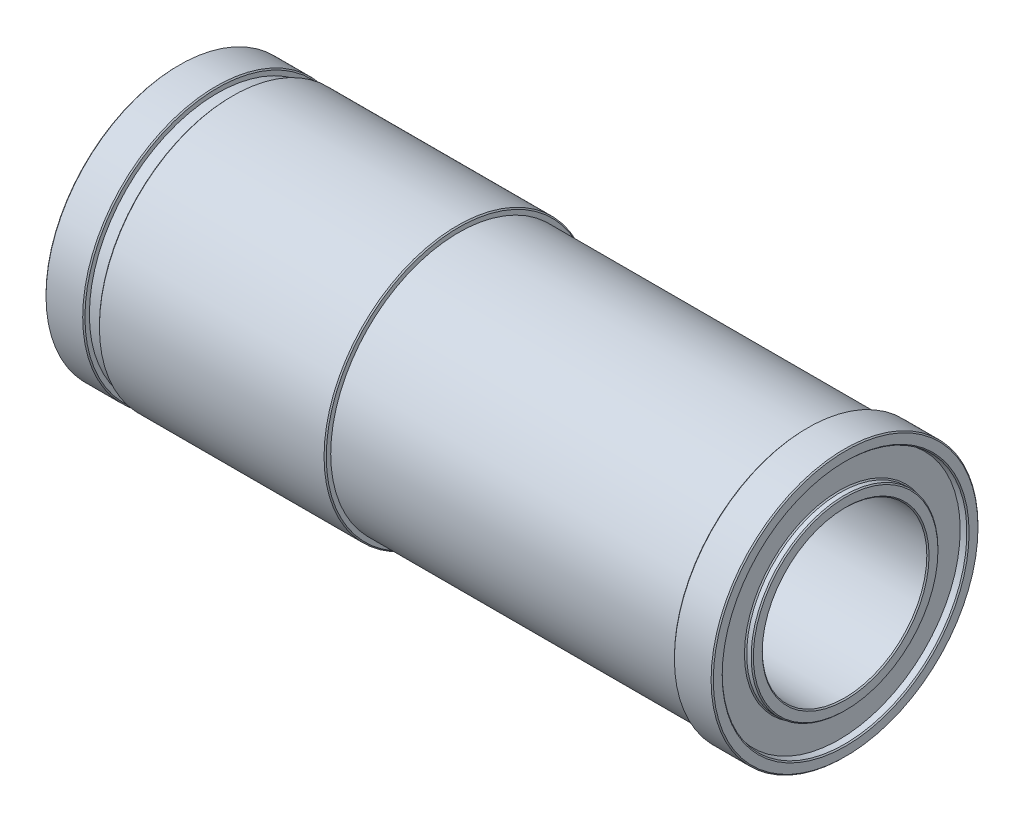
ISO-10303-21;
HEADER;
FILE_DESCRIPTION(('STEP AP214'),'2;1');
FILE_NAME('part.step','',(''),(''),'','','');
FILE_SCHEMA(('AUTOMOTIVE_DESIGN { 1 0 10303 214 1 1 1 1 }'));
ENDSEC;
DATA;
#1=APPLICATION_CONTEXT('core data for automotive mechanical design processes');
#2=APPLICATION_PROTOCOL_DEFINITION('international standard','automotive_design',2000,#1);
#3=PRODUCT_CONTEXT('',#1,'mechanical');
#4=PRODUCT('Part','Part','',(#3));
#5=PRODUCT_RELATED_PRODUCT_CATEGORY('part','',(#4));
#6=PRODUCT_DEFINITION_FORMATION('','',#4);
#7=PRODUCT_DEFINITION_CONTEXT('part definition',#1,'design');
#8=PRODUCT_DEFINITION('design','',#6,#7);
#9=PRODUCT_DEFINITION_SHAPE('','',#8);
#10=(LENGTH_UNIT() NAMED_UNIT(*) SI_UNIT(.MILLI.,.METRE.));
#11=(NAMED_UNIT(*) PLANE_ANGLE_UNIT() SI_UNIT($,.RADIAN.));
#12=(NAMED_UNIT(*) SI_UNIT($,.STERADIAN.) SOLID_ANGLE_UNIT());
#13=UNCERTAINTY_MEASURE_WITH_UNIT(LENGTH_MEASURE(1.E-05),#10,'distance_accuracy_value','');
#14=(GEOMETRIC_REPRESENTATION_CONTEXT(3) GLOBAL_UNCERTAINTY_ASSIGNED_CONTEXT((#13)) GLOBAL_UNIT_ASSIGNED_CONTEXT((#10,
#11,#12)) REPRESENTATION_CONTEXT('',''));
#15=CARTESIAN_POINT('',(0.,0.,0.));
#16=DIRECTION('',(0.,0.,1.));
#17=DIRECTION('',(1.,0.,0.));
#18=AXIS2_PLACEMENT_3D('',#15,#16,#17);
#19=CARTESIAN_POINT('',(0.,-3.00000000002488,0.));
#20=DIRECTION('',(-1.,0.,0.));
#21=DIRECTION('',(0.,0.,-1.));
#22=AXIS2_PLACEMENT_3D('',#19,#20,#21);
#23=CONICAL_SURFACE('',#22,7.5,0.785398163397435);
#24=CARTESIAN_POINT('',(0.0999999998896328,-3.00000000002488,0.));
#25=DIRECTION('',(1.,0.,0.));
#26=DIRECTION('',(0.,0.,-1.));
#27=AXIS2_PLACEMENT_3D('',#24,#25,#26);
#28=CIRCLE('',#27,7.40000000011037);
#29=CARTESIAN_POINT('',(0.0999999998896328,-3.00000000002488,-7.40000000011037));
#30=VERTEX_POINT('',#29);
#31=EDGE_CURVE('E89',#30,#30,#28,.T.);
#32=ORIENTED_EDGE('',*,*,#31,.T.);
#33=EDGE_LOOP('',(#32));
#34=FACE_BOUND('',#33,.T.);
#35=CARTESIAN_POINT('',(0.,-3.00000000002488,0.));
#36=DIRECTION('',(1.,0.,0.));
#37=DIRECTION('',(0.,0.,-1.));
#38=AXIS2_PLACEMENT_3D('',#35,#36,#37);
#39=CIRCLE('',#38,7.5);
#40=CARTESIAN_POINT('',(0.,-3.00000000002488,-7.5));
#41=VERTEX_POINT('',#40);
#42=EDGE_CURVE('E11',#41,#41,#39,.T.);
#43=ORIENTED_EDGE('',*,*,#42,.F.);
#44=EDGE_LOOP('',(#43));
#45=FACE_BOUND('',#44,.T.);
#46=ADVANCED_FACE('F43',(#34,#45),#23,.F.);
#47=CARTESIAN_POINT('',(0.,4.49999999997512,0.));
#48=DIRECTION('',(1.,0.,0.));
#49=DIRECTION('',(0.,0.,1.));
#50=AXIS2_PLACEMENT_3D('',#47,#48,#49);
#51=PLANE('',#50);
#52=ORIENTED_EDGE('',*,*,#42,.T.);
#53=EDGE_LOOP('',(#52));
#54=FACE_BOUND('',#53,.T.);
#55=CARTESIAN_POINT('',(0.,-3.00000000002488,0.));
#56=DIRECTION('',(1.,0.,0.));
#57=DIRECTION('',(0.,0.,-1.));
#58=AXIS2_PLACEMENT_3D('',#55,#56,#57);
#59=CIRCLE('',#58,8.30000000002656);
#60=CARTESIAN_POINT('',(0.,-3.00000000002488,-8.30000000002656));
#61=VERTEX_POINT('',#60);
#62=EDGE_CURVE('E49',#61,#61,#59,.T.);
#63=ORIENTED_EDGE('',*,*,#62,.F.);
#64=EDGE_LOOP('',(#63));
#65=FACE_BOUND('',#64,.T.);
#66=ADVANCED_FACE('F107',(#54,#65),#51,.F.);
#67=CARTESIAN_POINT('',(0.10000000001336,-3.00000000002488,0.));
#68=DIRECTION('',(1.,0.,0.));
#69=DIRECTION('',(0.,0.,1.));
#70=AXIS2_PLACEMENT_3D('',#67,#68,#69);
#71=CONICAL_SURFACE('',#70,8.40000000003992,0.785398163397466);
#72=ORIENTED_EDGE('',*,*,#62,.T.);
#73=EDGE_LOOP('',(#72));
#74=FACE_BOUND('',#73,.T.);
#75=CARTESIAN_POINT('',(0.10000000001336,-3.00000000002488,0.));
#76=DIRECTION('',(1.,0.,0.));
#77=DIRECTION('',(0.,0.,-1.));
#78=AXIS2_PLACEMENT_3D('',#75,#76,#77);
#79=CIRCLE('',#78,8.40000000003992);
#80=CARTESIAN_POINT('',(0.10000000001336,-3.00000000002488,-8.40000000003992));
#81=VERTEX_POINT('',#80);
#82=EDGE_CURVE('E53',#81,#81,#79,.T.);
#83=ORIENTED_EDGE('',*,*,#82,.F.);
#84=EDGE_LOOP('',(#83));
#85=FACE_BOUND('',#84,.T.);
#86=ADVANCED_FACE('F111',(#74,#85),#71,.T.);
#87=CARTESIAN_POINT('',(30.,-3.00000000002488,0.));
#88=DIRECTION('',(-1.,0.,0.));
#89=DIRECTION('',(0.,0.,-1.));
#90=AXIS2_PLACEMENT_3D('',#87,#88,#89);
#91=CYLINDRICAL_SURFACE('',#90,8.40000000003992);
#92=ORIENTED_EDGE('',*,*,#82,.T.);
#93=EDGE_LOOP('',(#92));
#94=FACE_BOUND('',#93,.T.);
#95=CARTESIAN_POINT('',(0.500000000013379,-3.00000000002488,0.));
#96=DIRECTION('',(1.,0.,0.));
#97=DIRECTION('',(0.,0.,-1.));
#98=AXIS2_PLACEMENT_3D('',#95,#96,#97);
#99=CIRCLE('',#98,8.40000000003992);
#100=CARTESIAN_POINT('',(0.500000000013379,-3.00000000002488,-8.40000000003992));
#101=VERTEX_POINT('',#100);
#102=EDGE_CURVE('E57',#101,#101,#99,.T.);
#103=ORIENTED_EDGE('',*,*,#102,.F.);
#104=EDGE_LOOP('',(#103));
#105=FACE_BOUND('',#104,.T.);
#106=ADVANCED_FACE('F115',(#94,#105),#91,.T.);
#107=CARTESIAN_POINT('',(0.600000000013375,-3.00000000002488,0.));
#108=DIRECTION('',(1.,0.,0.));
#109=DIRECTION('',(0.,0.,1.));
#110=AXIS2_PLACEMENT_3D('',#107,#108,#109);
#111=CONICAL_SURFACE('',#110,8.50000000003992,0.785398163397448);
#112=ORIENTED_EDGE('',*,*,#102,.T.);
#113=EDGE_LOOP('',(#112));
#114=FACE_BOUND('',#113,.T.);
#115=CARTESIAN_POINT('',(0.600000000013375,-3.00000000002488,0.));
#116=DIRECTION('',(1.,0.,0.));
#117=DIRECTION('',(0.,0.,-1.));
#118=AXIS2_PLACEMENT_3D('',#115,#116,#117);
#119=CIRCLE('',#118,8.50000000003992);
#120=CARTESIAN_POINT('',(0.600000000013375,-3.00000000002488,-8.50000000003992));
#121=VERTEX_POINT('',#120);
#122=EDGE_CURVE('E62',#121,#121,#119,.T.);
#123=ORIENTED_EDGE('',*,*,#122,.F.);
#124=EDGE_LOOP('',(#123));
#125=FACE_BOUND('',#124,.T.);
#126=ADVANCED_FACE('F121',(#114,#125),#111,.T.);
#127=CARTESIAN_POINT('',(0.600000000013375,5.50000000001504,0.));
#128=DIRECTION('',(1.,0.,0.));
#129=DIRECTION('',(0.,0.,1.));
#130=AXIS2_PLACEMENT_3D('',#127,#128,#129);
#131=PLANE('',#130);
#132=ORIENTED_EDGE('',*,*,#122,.T.);
#133=EDGE_LOOP('',(#132));
#134=FACE_BOUND('',#133,.T.);
#135=CARTESIAN_POINT('',(0.600000000013375,-3.00000000002488,0.));
#136=DIRECTION('',(1.,0.,0.));
#137=DIRECTION('',(0.,0.,-1.));
#138=AXIS2_PLACEMENT_3D('',#135,#136,#137);
#139=CIRCLE('',#138,10.9000000000249);
#140=CARTESIAN_POINT('',(0.600000000013375,-3.00000000002488,-10.9000000000249));
#141=VERTEX_POINT('',#140);
#142=EDGE_CURVE('E65',#141,#141,#139,.T.);
#143=ORIENTED_EDGE('',*,*,#142,.F.);
#144=EDGE_LOOP('',(#143));
#145=FACE_BOUND('',#144,.T.);
#146=ADVANCED_FACE('F125',(#134,#145),#131,.F.);
#147=CARTESIAN_POINT('',(30.,-3.00000000002488,0.));
#148=DIRECTION('',(-1.,0.,0.));
#149=DIRECTION('',(0.,0.,-1.));
#150=AXIS2_PLACEMENT_3D('',#147,#148,#149);
#151=CYLINDRICAL_SURFACE('',#150,10.9000000000249);
#152=ORIENTED_EDGE('',*,*,#142,.T.);
#153=EDGE_LOOP('',(#152));
#154=FACE_BOUND('',#153,.T.);
#155=CARTESIAN_POINT('',(59.3999999998077,-3.00000000002488,0.));
#156=DIRECTION('',(1.,0.,0.));
#157=DIRECTION('',(0.,0.,-1.));
#158=AXIS2_PLACEMENT_3D('',#155,#156,#157);
#159=CIRCLE('',#158,10.9000000000249);
#160=CARTESIAN_POINT('',(59.3999999998077,-3.00000000002488,-10.9000000000249));
#161=VERTEX_POINT('',#160);
#162=EDGE_CURVE('E68',#161,#161,#159,.T.);
#163=ORIENTED_EDGE('',*,*,#162,.F.);
#164=EDGE_LOOP('',(#163));
#165=FACE_BOUND('',#164,.T.);
#166=ADVANCED_FACE('F129',(#154,#165),#151,.T.);
#167=CARTESIAN_POINT('',(59.3999999998077,7.9,0.));
#168=DIRECTION('',(-1.,0.,0.));
#169=DIRECTION('',(0.,0.,-1.));
#170=AXIS2_PLACEMENT_3D('',#167,#168,#169);
#171=PLANE('',#170);
#172=ORIENTED_EDGE('',*,*,#162,.T.);
#173=EDGE_LOOP('',(#172));
#174=FACE_BOUND('',#173,.T.);
#175=CARTESIAN_POINT('',(59.3999999998077,-3.00000000002488,0.));
#176=DIRECTION('',(1.,0.,0.));
#177=DIRECTION('',(0.,0.,-1.));
#178=AXIS2_PLACEMENT_3D('',#175,#176,#177);
#179=CIRCLE('',#178,8.50000000002487);
#180=CARTESIAN_POINT('',(59.3999999998077,-3.00000000002488,-8.50000000002487));
#181=VERTEX_POINT('',#180);
#182=EDGE_CURVE('E71',#181,#181,#179,.T.);
#183=ORIENTED_EDGE('',*,*,#182,.F.);
#184=EDGE_LOOP('',(#183));
#185=FACE_BOUND('',#184,.T.);
#186=ADVANCED_FACE('F133',(#174,#185),#171,.F.);
#187=CARTESIAN_POINT('',(59.4999999998077,-3.00000000002488,0.));
#188=DIRECTION('',(-1.,0.,0.));
#189=DIRECTION('',(0.,0.,-1.));
#190=AXIS2_PLACEMENT_3D('',#187,#188,#189);
#191=CONICAL_SURFACE('',#190,8.40000000002487,0.785398163397466);
#192=ORIENTED_EDGE('',*,*,#182,.T.);
#193=EDGE_LOOP('',(#192));
#194=FACE_BOUND('',#193,.T.);
#195=CARTESIAN_POINT('',(59.4999999998077,-3.00000000002488,0.));
#196=DIRECTION('',(1.,0.,0.));
#197=DIRECTION('',(0.,0.,-1.));
#198=AXIS2_PLACEMENT_3D('',#195,#196,#197);
#199=CIRCLE('',#198,8.40000000002487);
#200=CARTESIAN_POINT('',(59.4999999998077,-3.00000000002488,-8.40000000002487));
#201=VERTEX_POINT('',#200);
#202=EDGE_CURVE('E74',#201,#201,#199,.T.);
#203=ORIENTED_EDGE('',*,*,#202,.F.);
#204=EDGE_LOOP('',(#203));
#205=FACE_BOUND('',#204,.T.);
#206=ADVANCED_FACE('F137',(#194,#205),#191,.T.);
#207=CARTESIAN_POINT('',(30.,-3.00000000002488,0.));
#208=DIRECTION('',(-1.,0.,0.));
#209=DIRECTION('',(0.,0.,-1.));
#210=AXIS2_PLACEMENT_3D('',#207,#208,#209);
#211=CYLINDRICAL_SURFACE('',#210,8.40000000002487);
#212=ORIENTED_EDGE('',*,*,#202,.T.);
#213=EDGE_LOOP('',(#212));
#214=FACE_BOUND('',#213,.T.);
#215=CARTESIAN_POINT('',(59.8999999998077,-3.00000000002488,0.));
#216=DIRECTION('',(1.,0.,0.));
#217=DIRECTION('',(0.,0.,-1.));
#218=AXIS2_PLACEMENT_3D('',#215,#216,#217);
#219=CIRCLE('',#218,8.40000000002487);
#220=CARTESIAN_POINT('',(59.8999999998077,-3.00000000002488,-8.40000000002487));
#221=VERTEX_POINT('',#220);
#222=EDGE_CURVE('E77',#221,#221,#219,.T.);
#223=ORIENTED_EDGE('',*,*,#222,.F.);
#224=EDGE_LOOP('',(#223));
#225=FACE_BOUND('',#224,.T.);
#226=ADVANCED_FACE('F141',(#214,#225),#211,.T.);
#227=CARTESIAN_POINT('',(59.9999999998077,-3.00000000002488,0.));
#228=DIRECTION('',(-1.,0.,0.));
#229=DIRECTION('',(0.,0.,-1.));
#230=AXIS2_PLACEMENT_3D('',#227,#228,#229);
#231=CONICAL_SURFACE('',#230,8.30000000002488,0.785398163397431);
#232=ORIENTED_EDGE('',*,*,#222,.T.);
#233=EDGE_LOOP('',(#232));
#234=FACE_BOUND('',#233,.T.);
#235=CARTESIAN_POINT('',(59.9999999998077,-3.00000000002488,0.));
#236=DIRECTION('',(1.,0.,0.));
#237=DIRECTION('',(0.,0.,-1.));
#238=AXIS2_PLACEMENT_3D('',#235,#236,#237);
#239=CIRCLE('',#238,8.30000000002488);
#240=CARTESIAN_POINT('',(59.9999999998077,-3.00000000002488,-8.30000000002488));
#241=VERTEX_POINT('',#240);
#242=EDGE_CURVE('E80',#241,#241,#239,.T.);
#243=ORIENTED_EDGE('',*,*,#242,.F.);
#244=EDGE_LOOP('',(#243));
#245=FACE_BOUND('',#244,.T.);
#246=ADVANCED_FACE('F145',(#234,#245),#231,.T.);
#247=CARTESIAN_POINT('',(59.9999999998077,5.3,0.));
#248=DIRECTION('',(-1.,0.,0.));
#249=DIRECTION('',(0.,0.,-1.));
#250=AXIS2_PLACEMENT_3D('',#247,#248,#249);
#251=PLANE('',#250);
#252=ORIENTED_EDGE('',*,*,#242,.T.);
#253=EDGE_LOOP('',(#252));
#254=FACE_BOUND('',#253,.T.);
#255=CARTESIAN_POINT('',(59.9999999998077,-3.00000000002488,0.));
#256=DIRECTION('',(1.,0.,0.));
#257=DIRECTION('',(0.,0.,-1.));
#258=AXIS2_PLACEMENT_3D('',#255,#256,#257);
#259=CIRCLE('',#258,7.50000000002842);
#260=CARTESIAN_POINT('',(59.9999999998077,-3.00000000002488,-7.50000000002842));
#261=VERTEX_POINT('',#260);
#262=EDGE_CURVE('E83',#261,#261,#259,.T.);
#263=ORIENTED_EDGE('',*,*,#262,.F.);
#264=EDGE_LOOP('',(#263));
#265=FACE_BOUND('',#264,.T.);
#266=ADVANCED_FACE('F103',(#254,#265),#251,.F.);
#267=CARTESIAN_POINT('',(59.8999999998896,-3.00000000002488,0.));
#268=DIRECTION('',(1.,0.,0.));
#269=DIRECTION('',(0.,0.,1.));
#270=AXIS2_PLACEMENT_3D('',#267,#268,#269);
#271=CONICAL_SURFACE('',#270,7.40000000011036,0.78539816339744);
#272=ORIENTED_EDGE('',*,*,#262,.T.);
#273=EDGE_LOOP('',(#272));
#274=FACE_BOUND('',#273,.T.);
#275=CARTESIAN_POINT('',(59.8999999998896,-3.00000000002488,0.));
#276=DIRECTION('',(1.,0.,0.));
#277=DIRECTION('',(0.,0.,-1.));
#278=AXIS2_PLACEMENT_3D('',#275,#276,#277);
#279=CIRCLE('',#278,7.40000000011036);
#280=CARTESIAN_POINT('',(59.8999999998896,-3.00000000002488,-7.40000000011036));
#281=VERTEX_POINT('',#280);
#282=EDGE_CURVE('E86',#281,#281,#279,.T.);
#283=ORIENTED_EDGE('',*,*,#282,.F.);
#284=EDGE_LOOP('',(#283));
#285=FACE_BOUND('',#284,.T.);
#286=ADVANCED_FACE('F97',(#274,#285),#271,.F.);
#287=CARTESIAN_POINT('',(30.,-3.00000000002488,0.));
#288=DIRECTION('',(-1.,0.,0.));
#289=DIRECTION('',(0.,0.,-1.));
#290=AXIS2_PLACEMENT_3D('',#287,#288,#289);
#291=CYLINDRICAL_SURFACE('',#290,7.40000000011037);
#292=ORIENTED_EDGE('',*,*,#282,.T.);
#293=EDGE_LOOP('',(#292));
#294=FACE_BOUND('',#293,.T.);
#295=ORIENTED_EDGE('',*,*,#31,.F.);
#296=EDGE_LOOP('',(#295));
#297=FACE_BOUND('',#296,.T.);
#298=ADVANCED_FACE('F95',(#294,#297),#291,.F.);
#299=CLOSED_SHELL('',(#46,#66,#86,#106,#126,#146,#166,#186,#206,#226,#246,#266,#286,#298));
#300=MANIFOLD_SOLID_BREP('B2',#299);
#301=CARTESIAN_POINT('',(25.2,8.5,0.));
#302=DIRECTION('',(1.,0.,0.));
#303=DIRECTION('',(0.,0.,1.));
#304=AXIS2_PLACEMENT_3D('',#301,#302,#303);
#305=PLANE('',#304);
#306=CARTESIAN_POINT('',(25.2,-3.,0.));
#307=DIRECTION('',(-1.,0.,0.));
#308=DIRECTION('',(0.,0.,1.));
#309=AXIS2_PLACEMENT_3D('',#306,#307,#308);
#310=CIRCLE('',#309,11.9);
#311=CARTESIAN_POINT('',(25.2,-3.,11.9));
#312=VERTEX_POINT('',#311);
#313=EDGE_CURVE('E42',#312,#312,#310,.T.);
#314=ORIENTED_EDGE('',*,*,#313,.F.);
#315=EDGE_LOOP('',(#314));
#316=FACE_BOUND('',#315,.T.);
#317=CARTESIAN_POINT('',(25.2,-3.,0.));
#318=DIRECTION('',(-1.,0.,0.));
#319=DIRECTION('',(0.,0.,1.));
#320=AXIS2_PLACEMENT_3D('',#317,#318,#319);
#321=CIRCLE('',#320,11.5);
#322=CARTESIAN_POINT('',(25.2,-3.,11.5));
#323=VERTEX_POINT('',#322);
#324=EDGE_CURVE('E316',#323,#323,#321,.T.);
#325=ORIENTED_EDGE('',*,*,#324,.T.);
#326=EDGE_LOOP('',(#325));
#327=FACE_BOUND('',#326,.T.);
#328=ADVANCED_FACE('F255',(#316,#327),#305,.T.);
#329=CARTESIAN_POINT('',(25.2,-3.,0.));
#330=DIRECTION('',(-1.,0.,0.));
#331=DIRECTION('',(0.,0.,-1.));
#332=AXIS2_PLACEMENT_3D('',#329,#330,#331);
#333=CONICAL_SURFACE('',#332,11.9,0.785398163397466);
#334=CARTESIAN_POINT('',(25.1,-3.,0.));
#335=DIRECTION('',(-1.,0.,0.));
#336=DIRECTION('',(0.,0.,1.));
#337=AXIS2_PLACEMENT_3D('',#334,#335,#336);
#338=CIRCLE('',#337,12.);
#339=CARTESIAN_POINT('',(25.1,-3.,12.));
#340=VERTEX_POINT('',#339);
#341=EDGE_CURVE('E261',#340,#340,#338,.T.);
#342=ORIENTED_EDGE('',*,*,#341,.F.);
#343=EDGE_LOOP('',(#342));
#344=FACE_BOUND('',#343,.T.);
#345=ORIENTED_EDGE('',*,*,#313,.T.);
#346=EDGE_LOOP('',(#345));
#347=FACE_BOUND('',#346,.T.);
#348=ADVANCED_FACE('F419',(#344,#347),#333,.T.);
#349=CARTESIAN_POINT('',(0.,-3.,0.));
#350=DIRECTION('',(1.,0.,0.));
#351=DIRECTION('',(0.,0.,1.));
#352=AXIS2_PLACEMENT_3D('',#349,#350,#351);
#353=CYLINDRICAL_SURFACE('',#352,12.);
#354=CARTESIAN_POINT('',(4.89999999999999,-3.,0.));
#355=DIRECTION('',(-1.,0.,0.));
#356=DIRECTION('',(0.,0.,1.));
#357=AXIS2_PLACEMENT_3D('',#354,#355,#356);
#358=CIRCLE('',#357,12.);
#359=CARTESIAN_POINT('',(4.89999999999999,-3.,12.));
#360=VERTEX_POINT('',#359);
#361=EDGE_CURVE('E265',#360,#360,#358,.T.);
#362=ORIENTED_EDGE('',*,*,#361,.F.);
#363=EDGE_LOOP('',(#362));
#364=FACE_BOUND('',#363,.T.);
#365=ORIENTED_EDGE('',*,*,#341,.T.);
#366=EDGE_LOOP('',(#365));
#367=FACE_BOUND('',#366,.T.);
#368=ADVANCED_FACE('F414',(#364,#367),#353,.T.);
#369=CARTESIAN_POINT('',(4.89999999999999,-3.,0.));
#370=DIRECTION('',(1.,0.,0.));
#371=DIRECTION('',(0.,0.,1.));
#372=AXIS2_PLACEMENT_3D('',#369,#370,#371);
#373=CONICAL_SURFACE('',#372,12.,0.78539816339744);
#374=CARTESIAN_POINT('',(4.8,-3.,0.));
#375=DIRECTION('',(-1.,0.,0.));
#376=DIRECTION('',(0.,0.,1.));
#377=AXIS2_PLACEMENT_3D('',#374,#375,#376);
#378=CIRCLE('',#377,11.9);
#379=CARTESIAN_POINT('',(4.8,-3.,11.9));
#380=VERTEX_POINT('',#379);
#381=EDGE_CURVE('E269',#380,#380,#378,.T.);
#382=ORIENTED_EDGE('',*,*,#381,.F.);
#383=EDGE_LOOP('',(#382));
#384=FACE_BOUND('',#383,.T.);
#385=ORIENTED_EDGE('',*,*,#361,.T.);
#386=EDGE_LOOP('',(#385));
#387=FACE_BOUND('',#386,.T.);
#388=ADVANCED_FACE('F408',(#384,#387),#373,.T.);
#389=CARTESIAN_POINT('',(4.8,8.90000000000001,0.));
#390=DIRECTION('',(-1.,0.,0.));
#391=DIRECTION('',(0.,0.,-1.));
#392=AXIS2_PLACEMENT_3D('',#389,#390,#391);
#393=PLANE('',#392);
#394=CARTESIAN_POINT('',(4.8,-3.,0.));
#395=DIRECTION('',(-1.,0.,0.));
#396=DIRECTION('',(0.,0.,1.));
#397=AXIS2_PLACEMENT_3D('',#394,#395,#396);
#398=CIRCLE('',#397,11.5);
#399=CARTESIAN_POINT('',(4.8,-3.,11.5));
#400=VERTEX_POINT('',#399);
#401=EDGE_CURVE('E274',#400,#400,#398,.T.);
#402=ORIENTED_EDGE('',*,*,#401,.F.);
#403=EDGE_LOOP('',(#402));
#404=FACE_BOUND('',#403,.T.);
#405=ORIENTED_EDGE('',*,*,#381,.T.);
#406=EDGE_LOOP('',(#405));
#407=FACE_BOUND('',#406,.T.);
#408=ADVANCED_FACE('F402',(#404,#407),#393,.T.);
#409=CARTESIAN_POINT('',(0.,-3.,0.));
#410=DIRECTION('',(1.,0.,0.));
#411=DIRECTION('',(0.,0.,1.));
#412=AXIS2_PLACEMENT_3D('',#409,#410,#411);
#413=CYLINDRICAL_SURFACE('',#412,11.5);
#414=CARTESIAN_POINT('',(3.5,-3.,0.));
#415=DIRECTION('',(-1.,0.,0.));
#416=DIRECTION('',(0.,0.,1.));
#417=AXIS2_PLACEMENT_3D('',#414,#415,#416);
#418=CIRCLE('',#417,11.5);
#419=CARTESIAN_POINT('',(3.5,-3.,11.5));
#420=VERTEX_POINT('',#419);
#421=EDGE_CURVE('E277',#420,#420,#418,.T.);
#422=ORIENTED_EDGE('',*,*,#421,.F.);
#423=EDGE_LOOP('',(#422));
#424=FACE_BOUND('',#423,.T.);
#425=ORIENTED_EDGE('',*,*,#401,.T.);
#426=EDGE_LOOP('',(#425));
#427=FACE_BOUND('',#426,.T.);
#428=ADVANCED_FACE('F396',(#424,#427),#413,.T.);
#429=CARTESIAN_POINT('',(3.5,8.5,0.));
#430=DIRECTION('',(1.,0.,0.));
#431=DIRECTION('',(0.,0.,1.));
#432=AXIS2_PLACEMENT_3D('',#429,#430,#431);
#433=PLANE('',#432);
#434=CARTESIAN_POINT('',(3.5,-3.,0.));
#435=DIRECTION('',(-1.,0.,0.));
#436=DIRECTION('',(0.,0.,1.));
#437=AXIS2_PLACEMENT_3D('',#434,#435,#436);
#438=CIRCLE('',#437,11.9);
#439=CARTESIAN_POINT('',(3.5,-3.,11.9));
#440=VERTEX_POINT('',#439);
#441=EDGE_CURVE('E280',#440,#440,#438,.T.);
#442=ORIENTED_EDGE('',*,*,#441,.F.);
#443=EDGE_LOOP('',(#442));
#444=FACE_BOUND('',#443,.T.);
#445=ORIENTED_EDGE('',*,*,#421,.T.);
#446=EDGE_LOOP('',(#445));
#447=FACE_BOUND('',#446,.T.);
#448=ADVANCED_FACE('F390',(#444,#447),#433,.T.);
#449=CARTESIAN_POINT('',(3.5,-3.,0.));
#450=DIRECTION('',(-1.,0.,0.));
#451=DIRECTION('',(0.,0.,-1.));
#452=AXIS2_PLACEMENT_3D('',#449,#450,#451);
#453=CONICAL_SURFACE('',#452,11.9,0.785398163397446);
#454=CARTESIAN_POINT('',(3.4,-3.,0.));
#455=DIRECTION('',(-1.,0.,0.));
#456=DIRECTION('',(0.,0.,1.));
#457=AXIS2_PLACEMENT_3D('',#454,#455,#456);
#458=CIRCLE('',#457,12.);
#459=CARTESIAN_POINT('',(3.4,-3.,12.));
#460=VERTEX_POINT('',#459);
#461=EDGE_CURVE('E283',#460,#460,#458,.T.);
#462=ORIENTED_EDGE('',*,*,#461,.F.);
#463=EDGE_LOOP('',(#462));
#464=FACE_BOUND('',#463,.T.);
#465=ORIENTED_EDGE('',*,*,#441,.T.);
#466=EDGE_LOOP('',(#465));
#467=FACE_BOUND('',#466,.T.);
#468=ADVANCED_FACE('F384',(#464,#467),#453,.T.);
#469=CARTESIAN_POINT('',(0.,-3.,0.));
#470=DIRECTION('',(1.,0.,0.));
#471=DIRECTION('',(0.,0.,1.));
#472=AXIS2_PLACEMENT_3D('',#469,#470,#471);
#473=CYLINDRICAL_SURFACE('',#472,12.);
#474=CARTESIAN_POINT('',(0.0999999999999946,-3.,0.));
#475=DIRECTION('',(-1.,0.,0.));
#476=DIRECTION('',(0.,0.,1.));
#477=AXIS2_PLACEMENT_3D('',#474,#475,#476);
#478=CIRCLE('',#477,12.);
#479=CARTESIAN_POINT('',(0.0999999999999946,-3.,12.));
#480=VERTEX_POINT('',#479);
#481=EDGE_CURVE('E286',#480,#480,#478,.T.);
#482=ORIENTED_EDGE('',*,*,#481,.F.);
#483=EDGE_LOOP('',(#482));
#484=FACE_BOUND('',#483,.T.);
#485=ORIENTED_EDGE('',*,*,#461,.T.);
#486=EDGE_LOOP('',(#485));
#487=FACE_BOUND('',#486,.T.);
#488=ADVANCED_FACE('F378',(#484,#487),#473,.T.);
#489=CARTESIAN_POINT('',(0.0999999999999946,-3.,0.));
#490=DIRECTION('',(1.,0.,0.));
#491=DIRECTION('',(0.,0.,1.));
#492=AXIS2_PLACEMENT_3D('',#489,#490,#491);
#493=CONICAL_SURFACE('',#492,12.,0.785398163397454);
#494=CARTESIAN_POINT('',(0.,-3.,0.));
#495=DIRECTION('',(-1.,0.,0.));
#496=DIRECTION('',(0.,0.,1.));
#497=AXIS2_PLACEMENT_3D('',#494,#495,#496);
#498=CIRCLE('',#497,11.9);
#499=CARTESIAN_POINT('',(0.,-3.,11.9));
#500=VERTEX_POINT('',#499);
#501=EDGE_CURVE('E289',#500,#500,#498,.T.);
#502=ORIENTED_EDGE('',*,*,#501,.F.);
#503=EDGE_LOOP('',(#502));
#504=FACE_BOUND('',#503,.T.);
#505=ORIENTED_EDGE('',*,*,#481,.T.);
#506=EDGE_LOOP('',(#505));
#507=FACE_BOUND('',#506,.T.);
#508=ADVANCED_FACE('F372',(#504,#507),#493,.T.);
#509=CARTESIAN_POINT('',(0.,8.9,0.));
#510=DIRECTION('',(-1.,0.,0.));
#511=DIRECTION('',(0.,0.,-1.));
#512=AXIS2_PLACEMENT_3D('',#509,#510,#511);
#513=PLANE('',#512);
#514=CARTESIAN_POINT('',(0.,-3.,0.));
#515=DIRECTION('',(-1.,0.,0.));
#516=DIRECTION('',(0.,0.,1.));
#517=AXIS2_PLACEMENT_3D('',#514,#515,#516);
#518=CIRCLE('',#517,11.);
#519=CARTESIAN_POINT('',(0.,-3.,11.));
#520=VERTEX_POINT('',#519);
#521=EDGE_CURVE('E292',#520,#520,#518,.T.);
#522=ORIENTED_EDGE('',*,*,#521,.F.);
#523=EDGE_LOOP('',(#522));
#524=FACE_BOUND('',#523,.T.);
#525=ORIENTED_EDGE('',*,*,#501,.T.);
#526=EDGE_LOOP('',(#525));
#527=FACE_BOUND('',#526,.T.);
#528=ADVANCED_FACE('F366',(#524,#527),#513,.T.);
#529=CARTESIAN_POINT('',(0.,-3.,0.));
#530=DIRECTION('',(1.,0.,0.));
#531=DIRECTION('',(0.,0.,1.));
#532=AXIS2_PLACEMENT_3D('',#529,#530,#531);
#533=CYLINDRICAL_SURFACE('',#532,11.);
#534=CARTESIAN_POINT('',(59.9,-3.,0.));
#535=DIRECTION('',(-1.,0.,0.));
#536=DIRECTION('',(0.,0.,1.));
#537=AXIS2_PLACEMENT_3D('',#534,#535,#536);
#538=CIRCLE('',#537,11.);
#539=CARTESIAN_POINT('',(59.9,-3.,11.));
#540=VERTEX_POINT('',#539);
#541=EDGE_CURVE('E295',#540,#540,#538,.T.);
#542=ORIENTED_EDGE('',*,*,#541,.F.);
#543=EDGE_LOOP('',(#542));
#544=FACE_BOUND('',#543,.T.);
#545=ORIENTED_EDGE('',*,*,#521,.T.);
#546=EDGE_LOOP('',(#545));
#547=FACE_BOUND('',#546,.T.);
#548=ADVANCED_FACE('F360',(#544,#547),#533,.F.);
#549=CARTESIAN_POINT('',(59.9,-3.,0.));
#550=DIRECTION('',(1.,0.,0.));
#551=DIRECTION('',(0.,0.,1.));
#552=AXIS2_PLACEMENT_3D('',#549,#550,#551);
#553=CONICAL_SURFACE('',#552,11.,0.785398163397431);
#554=CARTESIAN_POINT('',(60.,-3.,0.));
#555=DIRECTION('',(-1.,0.,0.));
#556=DIRECTION('',(0.,0.,1.));
#557=AXIS2_PLACEMENT_3D('',#554,#555,#556);
#558=CIRCLE('',#557,11.1);
#559=CARTESIAN_POINT('',(60.,-3.,11.1));
#560=VERTEX_POINT('',#559);
#561=EDGE_CURVE('E298',#560,#560,#558,.T.);
#562=ORIENTED_EDGE('',*,*,#561,.F.);
#563=EDGE_LOOP('',(#562));
#564=FACE_BOUND('',#563,.T.);
#565=ORIENTED_EDGE('',*,*,#541,.T.);
#566=EDGE_LOOP('',(#565));
#567=FACE_BOUND('',#566,.T.);
#568=ADVANCED_FACE('F354',(#564,#567),#553,.F.);
#569=CARTESIAN_POINT('',(60.,8.1,0.));
#570=DIRECTION('',(1.,0.,0.));
#571=DIRECTION('',(0.,0.,1.));
#572=AXIS2_PLACEMENT_3D('',#569,#570,#571);
#573=PLANE('',#572);
#574=CARTESIAN_POINT('',(60.,-3.,0.));
#575=DIRECTION('',(-1.,0.,0.));
#576=DIRECTION('',(0.,0.,1.));
#577=AXIS2_PLACEMENT_3D('',#574,#575,#576);
#578=CIRCLE('',#577,11.9);
#579=CARTESIAN_POINT('',(60.,-3.,11.9));
#580=VERTEX_POINT('',#579);
#581=EDGE_CURVE('E301',#580,#580,#578,.T.);
#582=ORIENTED_EDGE('',*,*,#581,.F.);
#583=EDGE_LOOP('',(#582));
#584=FACE_BOUND('',#583,.T.);
#585=ORIENTED_EDGE('',*,*,#561,.T.);
#586=EDGE_LOOP('',(#585));
#587=FACE_BOUND('',#586,.T.);
#588=ADVANCED_FACE('F348',(#584,#587),#573,.T.);
#589=CARTESIAN_POINT('',(60.,-3.,0.));
#590=DIRECTION('',(-1.,0.,0.));
#591=DIRECTION('',(0.,0.,-1.));
#592=AXIS2_PLACEMENT_3D('',#589,#590,#591);
#593=CONICAL_SURFACE('',#592,11.9,0.785398163397457);
#594=CARTESIAN_POINT('',(59.9,-3.,0.));
#595=DIRECTION('',(-1.,0.,0.));
#596=DIRECTION('',(0.,0.,1.));
#597=AXIS2_PLACEMENT_3D('',#594,#595,#596);
#598=CIRCLE('',#597,12.);
#599=CARTESIAN_POINT('',(59.9,-3.,12.));
#600=VERTEX_POINT('',#599);
#601=EDGE_CURVE('E304',#600,#600,#598,.T.);
#602=ORIENTED_EDGE('',*,*,#601,.F.);
#603=EDGE_LOOP('',(#602));
#604=FACE_BOUND('',#603,.T.);
#605=ORIENTED_EDGE('',*,*,#581,.T.);
#606=EDGE_LOOP('',(#605));
#607=FACE_BOUND('',#606,.T.);
#608=ADVANCED_FACE('F342',(#604,#607),#593,.T.);
#609=CARTESIAN_POINT('',(0.,-3.,0.));
#610=DIRECTION('',(1.,0.,0.));
#611=DIRECTION('',(0.,0.,1.));
#612=AXIS2_PLACEMENT_3D('',#609,#610,#611);
#613=CYLINDRICAL_SURFACE('',#612,12.);
#614=CARTESIAN_POINT('',(56.6,-3.,0.));
#615=DIRECTION('',(-1.,0.,0.));
#616=DIRECTION('',(0.,0.,1.));
#617=AXIS2_PLACEMENT_3D('',#614,#615,#616);
#618=CIRCLE('',#617,12.);
#619=CARTESIAN_POINT('',(56.6,-3.,12.));
#620=VERTEX_POINT('',#619);
#621=EDGE_CURVE('E307',#620,#620,#618,.T.);
#622=ORIENTED_EDGE('',*,*,#621,.F.);
#623=EDGE_LOOP('',(#622));
#624=FACE_BOUND('',#623,.T.);
#625=ORIENTED_EDGE('',*,*,#601,.T.);
#626=EDGE_LOOP('',(#625));
#627=FACE_BOUND('',#626,.T.);
#628=ADVANCED_FACE('F336',(#624,#627),#613,.T.);
#629=CARTESIAN_POINT('',(56.6,-3.,0.));
#630=DIRECTION('',(1.,0.,0.));
#631=DIRECTION('',(0.,0.,1.));
#632=AXIS2_PLACEMENT_3D('',#629,#630,#631);
#633=CONICAL_SURFACE('',#632,12.,0.785398163397431);
#634=CARTESIAN_POINT('',(56.5,-3.,0.));
#635=DIRECTION('',(-1.,0.,0.));
#636=DIRECTION('',(0.,0.,1.));
#637=AXIS2_PLACEMENT_3D('',#634,#635,#636);
#638=CIRCLE('',#637,11.9);
#639=CARTESIAN_POINT('',(56.5,-3.,11.9));
#640=VERTEX_POINT('',#639);
#641=EDGE_CURVE('E310',#640,#640,#638,.T.);
#642=ORIENTED_EDGE('',*,*,#641,.F.);
#643=EDGE_LOOP('',(#642));
#644=FACE_BOUND('',#643,.T.);
#645=ORIENTED_EDGE('',*,*,#621,.T.);
#646=EDGE_LOOP('',(#645));
#647=FACE_BOUND('',#646,.T.);
#648=ADVANCED_FACE('F330',(#644,#647),#633,.T.);
#649=CARTESIAN_POINT('',(56.5,8.9,0.));
#650=DIRECTION('',(-1.,0.,0.));
#651=DIRECTION('',(0.,0.,-1.));
#652=AXIS2_PLACEMENT_3D('',#649,#650,#651);
#653=PLANE('',#652);
#654=CARTESIAN_POINT('',(56.5,-3.,0.));
#655=DIRECTION('',(-1.,0.,0.));
#656=DIRECTION('',(0.,0.,1.));
#657=AXIS2_PLACEMENT_3D('',#654,#655,#656);
#658=CIRCLE('',#657,11.5);
#659=CARTESIAN_POINT('',(56.5,-3.,11.5));
#660=VERTEX_POINT('',#659);
#661=EDGE_CURVE('E313',#660,#660,#658,.T.);
#662=ORIENTED_EDGE('',*,*,#661,.F.);
#663=EDGE_LOOP('',(#662));
#664=FACE_BOUND('',#663,.T.);
#665=ORIENTED_EDGE('',*,*,#641,.T.);
#666=EDGE_LOOP('',(#665));
#667=FACE_BOUND('',#666,.T.);
#668=ADVANCED_FACE('F324',(#664,#667),#653,.T.);
#669=CARTESIAN_POINT('',(0.,-3.,0.));
#670=DIRECTION('',(1.,0.,0.));
#671=DIRECTION('',(0.,0.,1.));
#672=AXIS2_PLACEMENT_3D('',#669,#670,#671);
#673=CYLINDRICAL_SURFACE('',#672,11.5);
#674=ORIENTED_EDGE('',*,*,#324,.F.);
#675=EDGE_LOOP('',(#674));
#676=FACE_BOUND('',#675,.T.);
#677=ORIENTED_EDGE('',*,*,#661,.T.);
#678=EDGE_LOOP('',(#677));
#679=FACE_BOUND('',#678,.T.);
#680=ADVANCED_FACE('F321',(#676,#679),#673,.T.);
#681=CLOSED_SHELL('',(#328,#348,#368,#388,#408,#428,#448,#468,#488,#508,#528,#548,#568,#588,
#608,#628,#648,#668,#680));
#682=MANIFOLD_SOLID_BREP('B6',#681);
#683=ADVANCED_BREP_SHAPE_REPRESENTATION('',(#18,#300,#682),#14);
#684=SHAPE_DEFINITION_REPRESENTATION(#9,#683);
ENDSEC;
END-ISO-10303-21;
